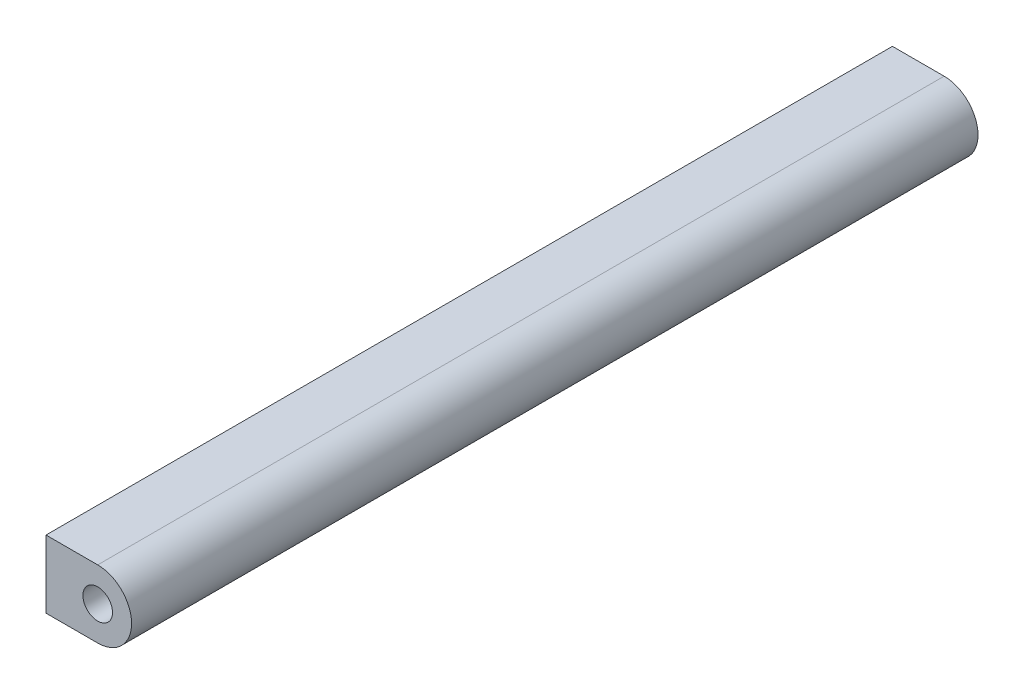
ISO-10303-21;
HEADER;
FILE_DESCRIPTION(('STEP AP214'),'2;1');
FILE_NAME('part.step','',(''),(''),'','','');
FILE_SCHEMA(('AUTOMOTIVE_DESIGN { 1 0 10303 214 1 1 1 1 }'));
ENDSEC;
DATA;
#1=APPLICATION_CONTEXT('core data for automotive mechanical design processes');
#2=APPLICATION_PROTOCOL_DEFINITION('international standard','automotive_design',2000,#1);
#3=PRODUCT_CONTEXT('',#1,'mechanical');
#4=PRODUCT('Part','Part','',(#3));
#5=PRODUCT_RELATED_PRODUCT_CATEGORY('part','',(#4));
#6=PRODUCT_DEFINITION_FORMATION('','',#4);
#7=PRODUCT_DEFINITION_CONTEXT('part definition',#1,'design');
#8=PRODUCT_DEFINITION('design','',#6,#7);
#9=PRODUCT_DEFINITION_SHAPE('','',#8);
#10=(LENGTH_UNIT() NAMED_UNIT(*) SI_UNIT(.MILLI.,.METRE.));
#11=(NAMED_UNIT(*) PLANE_ANGLE_UNIT() SI_UNIT($,.RADIAN.));
#12=(NAMED_UNIT(*) SI_UNIT($,.STERADIAN.) SOLID_ANGLE_UNIT());
#13=UNCERTAINTY_MEASURE_WITH_UNIT(LENGTH_MEASURE(1.E-05),#10,'distance_accuracy_value','');
#14=(GEOMETRIC_REPRESENTATION_CONTEXT(3) GLOBAL_UNCERTAINTY_ASSIGNED_CONTEXT((#13)) GLOBAL_UNIT_ASSIGNED_CONTEXT((#10,
#11,#12)) REPRESENTATION_CONTEXT('',''));
#15=CARTESIAN_POINT('',(0.,0.,0.));
#16=DIRECTION('',(0.,0.,1.));
#17=DIRECTION('',(1.,0.,0.));
#18=AXIS2_PLACEMENT_3D('',#15,#16,#17);
#19=CARTESIAN_POINT('',(0.,0.,500.));
#20=DIRECTION('',(0.,0.,-1.));
#21=DIRECTION('',(-1.,0.,0.));
#22=AXIS2_PLACEMENT_3D('',#19,#20,#21);
#23=PLANE('',#22);
#24=CARTESIAN_POINT('',(0.,0.,500.));
#25=DIRECTION('',(0.,0.,1.));
#26=DIRECTION('',(-1.,0.,0.));
#27=AXIS2_PLACEMENT_3D('',#24,#25,#26);
#28=CIRCLE('',#27,40.);
#29=CARTESIAN_POINT('',(0.,-40.,500.));
#30=VERTEX_POINT('',#29);
#31=CARTESIAN_POINT('',(0.,40.,500.));
#32=VERTEX_POINT('',#31);
#33=EDGE_CURVE('E84',#30,#32,#28,.T.);
#34=ORIENTED_EDGE('',*,*,#33,.T.);
#35=DIRECTION('',(-1.,0.,0.));
#36=VECTOR('',#35,1.);
#37=CARTESIAN_POINT('',(0.,40.,500.));
#38=LINE('',#37,#36);
#39=CARTESIAN_POINT('',(-61.0939685674777,40.,500.));
#40=VERTEX_POINT('',#39);
#41=EDGE_CURVE('E79',#32,#40,#38,.T.);
#42=ORIENTED_EDGE('',*,*,#41,.T.);
#43=DIRECTION('',(0.,-1.,0.));
#44=VECTOR('',#43,1.);
#45=CARTESIAN_POINT('',(-61.0939685674777,40.,500.));
#46=LINE('',#45,#44);
#47=CARTESIAN_POINT('',(-61.0939685674777,-40.,500.));
#48=VERTEX_POINT('',#47);
#49=EDGE_CURVE('E82',#40,#48,#46,.T.);
#50=ORIENTED_EDGE('',*,*,#49,.T.);
#51=DIRECTION('',(1.,0.,0.));
#52=VECTOR('',#51,1.);
#53=CARTESIAN_POINT('',(-61.0939685674777,-40.,500.));
#54=LINE('',#53,#52);
#55=EDGE_CURVE('E49',#48,#30,#54,.T.);
#56=ORIENTED_EDGE('',*,*,#55,.T.);
#57=EDGE_LOOP('',(#34,#42,#50,#56));
#58=FACE_BOUND('',#57,.T.);
#59=CARTESIAN_POINT('',(0.,0.,500.));
#60=DIRECTION('',(0.,0.,1.));
#61=DIRECTION('',(1.,0.,0.));
#62=AXIS2_PLACEMENT_3D('',#59,#60,#61);
#63=CIRCLE('',#62,17.5);
#64=CARTESIAN_POINT('',(17.5,0.,500.));
#65=VERTEX_POINT('',#64);
#66=EDGE_CURVE('E99',#65,#65,#63,.T.);
#67=ORIENTED_EDGE('',*,*,#66,.F.);
#68=EDGE_LOOP('',(#67));
#69=FACE_BOUND('',#68,.T.);
#70=ADVANCED_FACE('F32',(#58,#69),#23,.F.);
#71=CARTESIAN_POINT('',(0.,0.,-500.));
#72=DIRECTION('',(0.,0.,-1.));
#73=DIRECTION('',(-1.,0.,0.));
#74=AXIS2_PLACEMENT_3D('',#71,#72,#73);
#75=PLANE('',#74);
#76=CARTESIAN_POINT('',(0.,0.,-500.));
#77=DIRECTION('',(0.,0.,1.));
#78=DIRECTION('',(-1.,0.,0.));
#79=AXIS2_PLACEMENT_3D('',#76,#77,#78);
#80=CIRCLE('',#79,40.);
#81=CARTESIAN_POINT('',(0.,-40.,-500.));
#82=VERTEX_POINT('',#81);
#83=CARTESIAN_POINT('',(0.,40.,-500.));
#84=VERTEX_POINT('',#83);
#85=EDGE_CURVE('E96',#82,#84,#80,.T.);
#86=ORIENTED_EDGE('',*,*,#85,.F.);
#87=DIRECTION('',(1.,0.,0.));
#88=VECTOR('',#87,1.);
#89=CARTESIAN_POINT('',(-61.0939685674777,-40.,-500.));
#90=LINE('',#89,#88);
#91=CARTESIAN_POINT('',(-61.0939685674777,-40.,-500.));
#92=VERTEX_POINT('',#91);
#93=EDGE_CURVE('E72',#92,#82,#90,.T.);
#94=ORIENTED_EDGE('',*,*,#93,.F.);
#95=DIRECTION('',(0.,-1.,0.));
#96=VECTOR('',#95,1.);
#97=CARTESIAN_POINT('',(-61.0939685674777,40.,-500.));
#98=LINE('',#97,#96);
#99=CARTESIAN_POINT('',(-61.0939685674777,40.,-500.));
#100=VERTEX_POINT('',#99);
#101=EDGE_CURVE('E66',#100,#92,#98,.T.);
#102=ORIENTED_EDGE('',*,*,#101,.F.);
#103=DIRECTION('',(-1.,0.,0.));
#104=VECTOR('',#103,1.);
#105=CARTESIAN_POINT('',(0.,40.,-500.));
#106=LINE('',#105,#104);
#107=EDGE_CURVE('E88',#84,#100,#106,.T.);
#108=ORIENTED_EDGE('',*,*,#107,.F.);
#109=EDGE_LOOP('',(#86,#94,#102,#108));
#110=FACE_BOUND('',#109,.T.);
#111=CARTESIAN_POINT('',(0.,0.,-500.));
#112=DIRECTION('',(0.,0.,1.));
#113=DIRECTION('',(1.,0.,0.));
#114=AXIS2_PLACEMENT_3D('',#111,#112,#113);
#115=CIRCLE('',#114,17.5);
#116=CARTESIAN_POINT('',(17.5,0.,-500.));
#117=VERTEX_POINT('',#116);
#118=EDGE_CURVE('E111',#117,#117,#115,.T.);
#119=ORIENTED_EDGE('',*,*,#118,.T.);
#120=EDGE_LOOP('',(#119));
#121=FACE_BOUND('',#120,.T.);
#122=ADVANCED_FACE('F107',(#110,#121),#75,.T.);
#123=CARTESIAN_POINT('',(0.,0.,500.));
#124=DIRECTION('',(0.,0.,-1.));
#125=DIRECTION('',(-1.,0.,0.));
#126=AXIS2_PLACEMENT_3D('',#123,#124,#125);
#127=CYLINDRICAL_SURFACE('',#126,40.);
#128=ORIENTED_EDGE('',*,*,#85,.T.);
#129=DIRECTION('',(0.,0.,-1.));
#130=VECTOR('',#129,1.);
#131=CARTESIAN_POINT('',(0.,40.,500.));
#132=LINE('',#131,#130);
#133=EDGE_CURVE('E11',#32,#84,#132,.T.);
#134=ORIENTED_EDGE('',*,*,#133,.F.);
#135=ORIENTED_EDGE('',*,*,#33,.F.);
#136=DIRECTION('',(0.,0.,-1.));
#137=VECTOR('',#136,1.);
#138=CARTESIAN_POINT('',(0.,-40.,500.));
#139=LINE('',#138,#137);
#140=EDGE_CURVE('E92',#30,#82,#139,.T.);
#141=ORIENTED_EDGE('',*,*,#140,.T.);
#142=EDGE_LOOP('',(#128,#134,#135,#141));
#143=FACE_BOUND('',#142,.T.);
#144=ADVANCED_FACE('F34',(#143),#127,.T.);
#145=CARTESIAN_POINT('',(0.,40.,500.));
#146=DIRECTION('',(0.,-1.,0.));
#147=DIRECTION('',(1.,0.,0.));
#148=AXIS2_PLACEMENT_3D('',#145,#146,#147);
#149=PLANE('',#148);
#150=ORIENTED_EDGE('',*,*,#107,.T.);
#151=DIRECTION('',(0.,0.,-1.));
#152=VECTOR('',#151,1.);
#153=CARTESIAN_POINT('',(-61.0939685674777,40.,500.));
#154=LINE('',#153,#152);
#155=EDGE_CURVE('E41',#40,#100,#154,.T.);
#156=ORIENTED_EDGE('',*,*,#155,.F.);
#157=ORIENTED_EDGE('',*,*,#41,.F.);
#158=ORIENTED_EDGE('',*,*,#133,.T.);
#159=EDGE_LOOP('',(#150,#156,#157,#158));
#160=FACE_BOUND('',#159,.T.);
#161=ADVANCED_FACE('F87',(#160),#149,.F.);
#162=CARTESIAN_POINT('',(-61.0939685674777,40.,500.));
#163=DIRECTION('',(1.,0.,0.));
#164=DIRECTION('',(0.,1.,0.));
#165=AXIS2_PLACEMENT_3D('',#162,#163,#164);
#166=PLANE('',#165);
#167=CARTESIAN_POINT('',(-61.0939685674777,0.,0.));
#168=DIRECTION('',(-1.,0.,0.));
#169=DIRECTION('',(0.,-1.,0.));
#170=AXIS2_PLACEMENT_3D('',#167,#168,#169);
#171=CIRCLE('',#170,22.5);
#172=CARTESIAN_POINT('',(-61.0939685674777,-22.5,0.));
#173=VERTEX_POINT('',#172);
#174=EDGE_CURVE('E117',#173,#173,#171,.T.);
#175=ORIENTED_EDGE('',*,*,#174,.F.);
#176=EDGE_LOOP('',(#175));
#177=FACE_BOUND('',#176,.T.);
#178=ORIENTED_EDGE('',*,*,#101,.T.);
#179=DIRECTION('',(0.,0.,-1.));
#180=VECTOR('',#179,1.);
#181=CARTESIAN_POINT('',(-61.0939685674777,-40.,500.));
#182=LINE('',#181,#180);
#183=EDGE_CURVE('E89',#48,#92,#182,.T.);
#184=ORIENTED_EDGE('',*,*,#183,.F.);
#185=ORIENTED_EDGE('',*,*,#49,.F.);
#186=ORIENTED_EDGE('',*,*,#155,.T.);
#187=EDGE_LOOP('',(#178,#184,#185,#186));
#188=FACE_BOUND('',#187,.T.);
#189=ADVANCED_FACE('F90',(#177,#188),#166,.F.);
#190=CARTESIAN_POINT('',(-61.0939685674777,-40.,500.));
#191=DIRECTION('',(0.,1.,0.));
#192=DIRECTION('',(0.,0.,1.));
#193=AXIS2_PLACEMENT_3D('',#190,#191,#192);
#194=PLANE('',#193);
#195=ORIENTED_EDGE('',*,*,#93,.T.);
#196=ORIENTED_EDGE('',*,*,#140,.F.);
#197=ORIENTED_EDGE('',*,*,#55,.F.);
#198=ORIENTED_EDGE('',*,*,#183,.T.);
#199=EDGE_LOOP('',(#195,#196,#197,#198));
#200=FACE_BOUND('',#199,.T.);
#201=ADVANCED_FACE('F104',(#200),#194,.F.);
#202=CARTESIAN_POINT('',(0.,0.,500.));
#203=DIRECTION('',(0.,0.,-1.));
#204=DIRECTION('',(-1.,0.,0.));
#205=AXIS2_PLACEMENT_3D('',#202,#203,#204);
#206=CYLINDRICAL_SURFACE('',#205,17.5);
#207=ORIENTED_EDGE('',*,*,#66,.T.);
#208=EDGE_LOOP('',(#207));
#209=FACE_BOUND('',#208,.T.);
#210=ORIENTED_EDGE('',*,*,#118,.F.);
#211=EDGE_LOOP('',(#210));
#212=FACE_BOUND('',#211,.T.);
#213=ADVANCED_FACE('F128',(#209,#212),#206,.F.);
#214=CARTESIAN_POINT('',(-31.0939685674777,0.,0.));
#215=DIRECTION('',(-1.,0.,0.));
#216=DIRECTION('',(0.,-1.,0.));
#217=AXIS2_PLACEMENT_3D('',#214,#215,#216);
#218=CYLINDRICAL_SURFACE('',#217,22.5);
#219=CARTESIAN_POINT('',(-31.0939685674777,0.,0.));
#220=DIRECTION('',(-1.,0.,0.));
#221=DIRECTION('',(0.,-1.,0.));
#222=AXIS2_PLACEMENT_3D('',#219,#220,#221);
#223=CIRCLE('',#222,22.5);
#224=CARTESIAN_POINT('',(-31.0939685674777,-22.5,0.));
#225=VERTEX_POINT('',#224);
#226=EDGE_CURVE('E114',#225,#225,#223,.T.);
#227=ORIENTED_EDGE('',*,*,#226,.F.);
#228=EDGE_LOOP('',(#227));
#229=FACE_BOUND('',#228,.T.);
#230=ORIENTED_EDGE('',*,*,#174,.T.);
#231=EDGE_LOOP('',(#230));
#232=FACE_BOUND('',#231,.T.);
#233=ADVANCED_FACE('F125',(#229,#232),#218,.F.);
#234=CARTESIAN_POINT('',(-31.0939685674777,0.,0.));
#235=DIRECTION('',(-1.,0.,0.));
#236=DIRECTION('',(0.,-1.,0.));
#237=AXIS2_PLACEMENT_3D('',#234,#235,#236);
#238=PLANE('',#237);
#239=ORIENTED_EDGE('',*,*,#226,.T.);
#240=EDGE_LOOP('',(#239));
#241=FACE_BOUND('',#240,.T.);
#242=ADVANCED_FACE('F123',(#241),#238,.T.);
#243=CLOSED_SHELL('',(#70,#122,#144,#161,#189,#201,#213,#233,#242));
#244=MANIFOLD_SOLID_BREP('B2',#243);
#245=ADVANCED_BREP_SHAPE_REPRESENTATION('',(#18,#244),#14);
#246=SHAPE_DEFINITION_REPRESENTATION(#9,#245);
ENDSEC;
END-ISO-10303-21;
